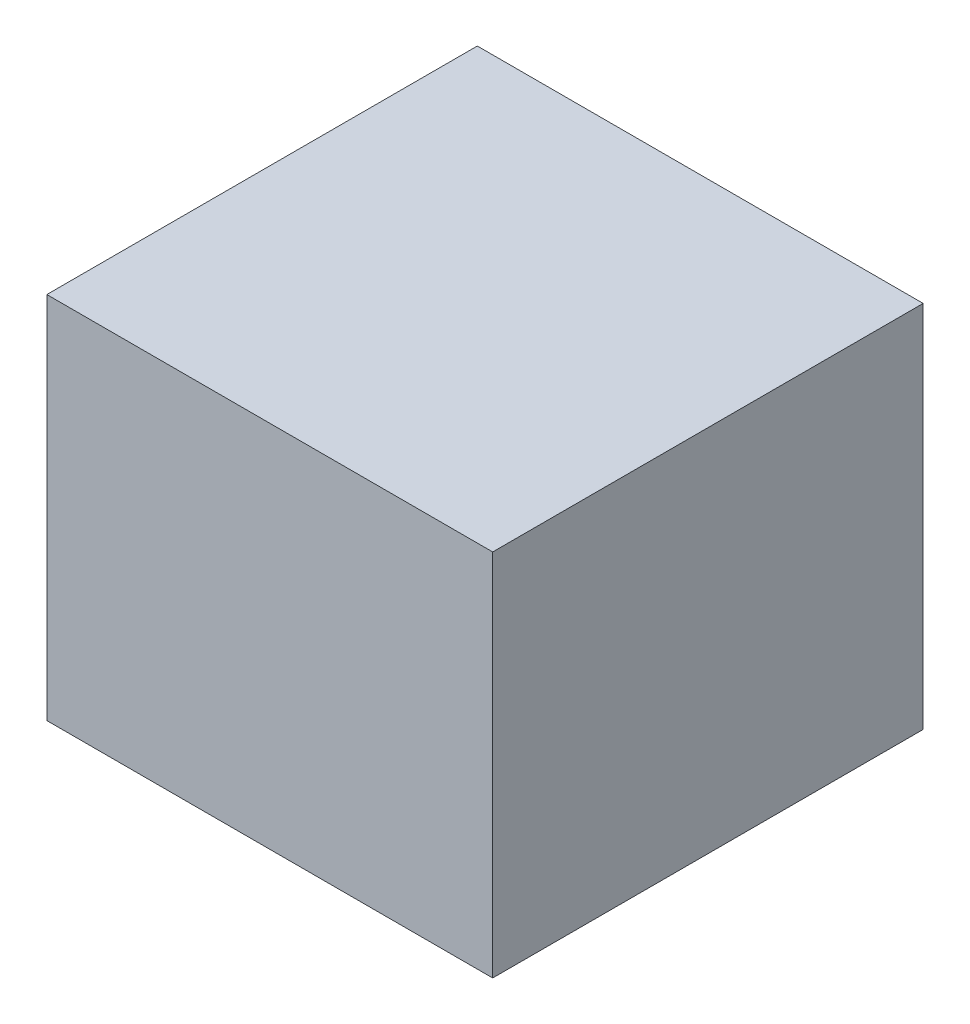
ISO-10303-21;
HEADER;
FILE_DESCRIPTION(('STEP AP214'),'2;1');
FILE_NAME('part.step','',(''),(''),'','','');
FILE_SCHEMA(('AUTOMOTIVE_DESIGN { 1 0 10303 214 1 1 1 1 }'));
ENDSEC;
DATA;
#1=APPLICATION_CONTEXT('core data for automotive mechanical design processes');
#2=APPLICATION_PROTOCOL_DEFINITION('international standard','automotive_design',2000,#1);
#3=PRODUCT_CONTEXT('',#1,'mechanical');
#4=PRODUCT('Part','Part','',(#3));
#5=PRODUCT_RELATED_PRODUCT_CATEGORY('part','',(#4));
#6=PRODUCT_DEFINITION_FORMATION('','',#4);
#7=PRODUCT_DEFINITION_CONTEXT('part definition',#1,'design');
#8=PRODUCT_DEFINITION('design','',#6,#7);
#9=PRODUCT_DEFINITION_SHAPE('','',#8);
#10=(LENGTH_UNIT() NAMED_UNIT(*) SI_UNIT(.MILLI.,.METRE.));
#11=(NAMED_UNIT(*) PLANE_ANGLE_UNIT() SI_UNIT($,.RADIAN.));
#12=(NAMED_UNIT(*) SI_UNIT($,.STERADIAN.) SOLID_ANGLE_UNIT());
#13=UNCERTAINTY_MEASURE_WITH_UNIT(LENGTH_MEASURE(1.E-05),#10,'distance_accuracy_value','');
#14=(GEOMETRIC_REPRESENTATION_CONTEXT(3) GLOBAL_UNCERTAINTY_ASSIGNED_CONTEXT((#13)) GLOBAL_UNIT_ASSIGNED_CONTEXT((#10,
#11,#12)) REPRESENTATION_CONTEXT('',''));
#15=CARTESIAN_POINT('',(0.,0.,0.));
#16=DIRECTION('',(0.,0.,1.));
#17=DIRECTION('',(1.,0.,0.));
#18=AXIS2_PLACEMENT_3D('',#15,#16,#17);
#19=CARTESIAN_POINT('',(0.,1.270000005615E-06,1.39999974));
#20=DIRECTION('',(0.,0.,-1.));
#21=DIRECTION('',(0.,-1.,0.));
#22=AXIS2_PLACEMENT_3D('',#19,#20,#21);
#23=PLANE('',#22);
#24=DIRECTION('',(0.,-1.,0.));
#25=VECTOR('',#24,1.);
#26=CARTESIAN_POINT('',(0.72499982,0.60000134,1.39999974));
#27=LINE('',#26,#25);
#28=CARTESIAN_POINT('',(0.72499982,0.60000134,1.39999974));
#29=VERTEX_POINT('',#28);
#30=CARTESIAN_POINT('',(0.72499982,-0.5999988,1.39999974));
#31=VERTEX_POINT('',#30);
#32=EDGE_CURVE('E27',#29,#31,#27,.T.);
#33=ORIENTED_EDGE('',*,*,#32,.F.);
#34=DIRECTION('',(1.,0.,0.));
#35=VECTOR('',#34,1.);
#36=CARTESIAN_POINT('',(-0.72499982,0.60000134,1.39999974));
#37=LINE('',#36,#35);
#38=CARTESIAN_POINT('',(-0.72499982,0.60000134,1.39999974));
#39=VERTEX_POINT('',#38);
#40=EDGE_CURVE('E84',#39,#29,#37,.T.);
#41=ORIENTED_EDGE('',*,*,#40,.F.);
#42=DIRECTION('',(0.,1.,0.));
#43=VECTOR('',#42,1.);
#44=CARTESIAN_POINT('',(-0.72499982,-0.5999988,1.39999974));
#45=LINE('',#44,#43);
#46=CARTESIAN_POINT('',(-0.72499982,-0.5999988,1.39999974));
#47=VERTEX_POINT('',#46);
#48=EDGE_CURVE('E87',#47,#39,#45,.T.);
#49=ORIENTED_EDGE('',*,*,#48,.F.);
#50=DIRECTION('',(-1.,0.,0.));
#51=VECTOR('',#50,1.);
#52=CARTESIAN_POINT('',(0.72499982,-0.5999988,1.39999974));
#53=LINE('',#52,#51);
#54=EDGE_CURVE('E97',#31,#47,#53,.T.);
#55=ORIENTED_EDGE('',*,*,#54,.F.);
#56=EDGE_LOOP('',(#33,#41,#49,#55));
#57=FACE_BOUND('',#56,.T.);
#58=ADVANCED_FACE('F17',(#57),#23,.F.);
#59=CARTESIAN_POINT('',(0.,1.270000005615E-06,0.));
#60=DIRECTION('',(0.,0.,-1.));
#61=DIRECTION('',(0.,-1.,0.));
#62=AXIS2_PLACEMENT_3D('',#59,#60,#61);
#63=PLANE('',#62);
#64=DIRECTION('',(-1.,0.,0.));
#65=VECTOR('',#64,1.);
#66=CARTESIAN_POINT('',(0.72499982,-0.5999988,0.));
#67=LINE('',#66,#65);
#68=CARTESIAN_POINT('',(0.72499982,-0.5999988,0.));
#69=VERTEX_POINT('',#68);
#70=CARTESIAN_POINT('',(-0.72499982,-0.5999988,0.));
#71=VERTEX_POINT('',#70);
#72=EDGE_CURVE('E79',#69,#71,#67,.T.);
#73=ORIENTED_EDGE('',*,*,#72,.T.);
#74=DIRECTION('',(0.,1.,0.));
#75=VECTOR('',#74,1.);
#76=CARTESIAN_POINT('',(-0.72499982,-0.5999988,0.));
#77=LINE('',#76,#75);
#78=CARTESIAN_POINT('',(-0.72499982,0.60000134,0.));
#79=VERTEX_POINT('',#78);
#80=EDGE_CURVE('E77',#71,#79,#77,.T.);
#81=ORIENTED_EDGE('',*,*,#80,.T.);
#82=DIRECTION('',(1.,0.,0.));
#83=VECTOR('',#82,1.);
#84=CARTESIAN_POINT('',(-0.72499982,0.60000134,0.));
#85=LINE('',#84,#83);
#86=CARTESIAN_POINT('',(0.72499982,0.60000134,0.));
#87=VERTEX_POINT('',#86);
#88=EDGE_CURVE('E65',#79,#87,#85,.T.);
#89=ORIENTED_EDGE('',*,*,#88,.T.);
#90=DIRECTION('',(0.,-1.,0.));
#91=VECTOR('',#90,1.);
#92=CARTESIAN_POINT('',(0.72499982,0.60000134,0.));
#93=LINE('',#92,#91);
#94=EDGE_CURVE('E11',#87,#69,#93,.T.);
#95=ORIENTED_EDGE('',*,*,#94,.T.);
#96=EDGE_LOOP('',(#73,#81,#89,#95));
#97=FACE_BOUND('',#96,.T.);
#98=ADVANCED_FACE('F19',(#97),#63,.T.);
#99=CARTESIAN_POINT('',(0.72499982,0.60000134,0.));
#100=DIRECTION('',(1.,0.,0.));
#101=DIRECTION('',(0.,1.,0.));
#102=AXIS2_PLACEMENT_3D('',#99,#100,#101);
#103=PLANE('',#102);
#104=DIRECTION('',(0.,0.,1.));
#105=VECTOR('',#104,1.);
#106=CARTESIAN_POINT('',(0.72499982,0.60000134,0.));
#107=LINE('',#106,#105);
#108=EDGE_CURVE('E72',#87,#29,#107,.T.);
#109=ORIENTED_EDGE('',*,*,#108,.T.);
#110=ORIENTED_EDGE('',*,*,#32,.T.);
#111=DIRECTION('',(0.,0.,1.));
#112=VECTOR('',#111,1.);
#113=CARTESIAN_POINT('',(0.72499982,-0.5999988,0.));
#114=LINE('',#113,#112);
#115=EDGE_CURVE('E102',#69,#31,#114,.T.);
#116=ORIENTED_EDGE('',*,*,#115,.F.);
#117=ORIENTED_EDGE('',*,*,#94,.F.);
#118=EDGE_LOOP('',(#109,#110,#116,#117));
#119=FACE_BOUND('',#118,.T.);
#120=ADVANCED_FACE('F112',(#119),#103,.T.);
#121=CARTESIAN_POINT('',(-0.72499982,0.60000134,0.));
#122=DIRECTION('',(0.,1.,0.));
#123=DIRECTION('',(1.,0.,0.));
#124=AXIS2_PLACEMENT_3D('',#121,#122,#123);
#125=PLANE('',#124);
#126=DIRECTION('',(0.,0.,1.));
#127=VECTOR('',#126,1.);
#128=CARTESIAN_POINT('',(-0.72499982,0.60000134,0.));
#129=LINE('',#128,#127);
#130=EDGE_CURVE('E70',#79,#39,#129,.T.);
#131=ORIENTED_EDGE('',*,*,#130,.T.);
#132=ORIENTED_EDGE('',*,*,#40,.T.);
#133=ORIENTED_EDGE('',*,*,#108,.F.);
#134=ORIENTED_EDGE('',*,*,#88,.F.);
#135=EDGE_LOOP('',(#131,#132,#133,#134));
#136=FACE_BOUND('',#135,.T.);
#137=ADVANCED_FACE('F67',(#136),#125,.T.);
#138=CARTESIAN_POINT('',(-0.72499982,-0.5999988,0.));
#139=DIRECTION('',(-1.,0.,0.));
#140=DIRECTION('',(0.,0.,1.));
#141=AXIS2_PLACEMENT_3D('',#138,#139,#140);
#142=PLANE('',#141);
#143=DIRECTION('',(0.,0.,1.));
#144=VECTOR('',#143,1.);
#145=CARTESIAN_POINT('',(-0.72499982,-0.5999988,0.));
#146=LINE('',#145,#144);
#147=EDGE_CURVE('E101',#71,#47,#146,.T.);
#148=ORIENTED_EDGE('',*,*,#147,.T.);
#149=ORIENTED_EDGE('',*,*,#48,.T.);
#150=ORIENTED_EDGE('',*,*,#130,.F.);
#151=ORIENTED_EDGE('',*,*,#80,.F.);
#152=EDGE_LOOP('',(#148,#149,#150,#151));
#153=FACE_BOUND('',#152,.T.);
#154=ADVANCED_FACE('F86',(#153),#142,.T.);
#155=CARTESIAN_POINT('',(0.72499982,-0.5999988,0.));
#156=DIRECTION('',(0.,-1.,0.));
#157=DIRECTION('',(0.,0.,-1.));
#158=AXIS2_PLACEMENT_3D('',#155,#156,#157);
#159=PLANE('',#158);
#160=ORIENTED_EDGE('',*,*,#115,.T.);
#161=ORIENTED_EDGE('',*,*,#54,.T.);
#162=ORIENTED_EDGE('',*,*,#147,.F.);
#163=ORIENTED_EDGE('',*,*,#72,.F.);
#164=EDGE_LOOP('',(#160,#161,#162,#163));
#165=FACE_BOUND('',#164,.T.);
#166=ADVANCED_FACE('F119',(#165),#159,.T.);
#167=CLOSED_SHELL('',(#58,#98,#120,#137,#154,#166));
#168=MANIFOLD_SOLID_BREP('B1',#167);
#169=ADVANCED_BREP_SHAPE_REPRESENTATION('',(#18,#168),#14);
#170=SHAPE_DEFINITION_REPRESENTATION(#9,#169);
ENDSEC;
END-ISO-10303-21;
